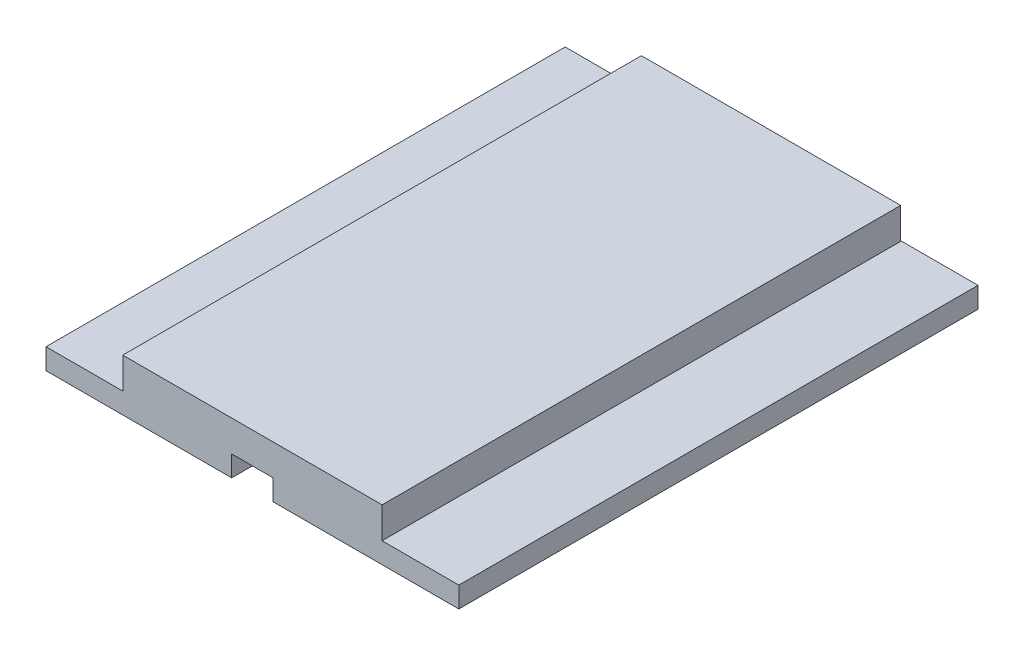
ISO-10303-21;
HEADER;
FILE_DESCRIPTION(('STEP AP214'),'2;1');
FILE_NAME('part.step','',(''),(''),'','','');
FILE_SCHEMA(('AUTOMOTIVE_DESIGN { 1 0 10303 214 1 1 1 1 }'));
ENDSEC;
DATA;
#1=APPLICATION_CONTEXT('core data for automotive mechanical design processes');
#2=APPLICATION_PROTOCOL_DEFINITION('international standard','automotive_design',2000,#1);
#3=PRODUCT_CONTEXT('',#1,'mechanical');
#4=PRODUCT('Part','Part','',(#3));
#5=PRODUCT_RELATED_PRODUCT_CATEGORY('part','',(#4));
#6=PRODUCT_DEFINITION_FORMATION('','',#4);
#7=PRODUCT_DEFINITION_CONTEXT('part definition',#1,'design');
#8=PRODUCT_DEFINITION('design','',#6,#7);
#9=PRODUCT_DEFINITION_SHAPE('','',#8);
#10=(LENGTH_UNIT() NAMED_UNIT(*) SI_UNIT(.MILLI.,.METRE.));
#11=(NAMED_UNIT(*) PLANE_ANGLE_UNIT() SI_UNIT($,.RADIAN.));
#12=(NAMED_UNIT(*) SI_UNIT($,.STERADIAN.) SOLID_ANGLE_UNIT());
#13=UNCERTAINTY_MEASURE_WITH_UNIT(LENGTH_MEASURE(1.E-05),#10,'distance_accuracy_value','');
#14=(GEOMETRIC_REPRESENTATION_CONTEXT(3) GLOBAL_UNCERTAINTY_ASSIGNED_CONTEXT((#13)) GLOBAL_UNIT_ASSIGNED_CONTEXT((#10,
#11,#12)) REPRESENTATION_CONTEXT('',''));
#15=CARTESIAN_POINT('',(0.,0.,0.));
#16=DIRECTION('',(0.,0.,1.));
#17=DIRECTION('',(1.,0.,0.));
#18=AXIS2_PLACEMENT_3D('',#15,#16,#17);
#19=CARTESIAN_POINT('',(-1.94300518134715,0.6,1.15284974093264));
#20=DIRECTION('',(0.,0.,-1.));
#21=DIRECTION('',(-1.,0.,0.));
#22=AXIS2_PLACEMENT_3D('',#19,#20,#21);
#23=PLANE('',#22);
#24=DIRECTION('',(0.,1.,0.));
#25=VECTOR('',#24,1.);
#26=CARTESIAN_POINT('',(-3.42300518134715,0.,1.15284974093264));
#27=LINE('',#26,#25);
#28=CARTESIAN_POINT('',(-3.42300518134715,-0.4,1.15284974093264));
#29=VERTEX_POINT('',#28);
#30=CARTESIAN_POINT('',(-3.42300518134715,0.,1.15284974093264));
#31=VERTEX_POINT('',#30);
#32=EDGE_CURVE('E140',#29,#31,#27,.T.);
#33=ORIENTED_EDGE('',*,*,#32,.F.);
#34=DIRECTION('',(-1.,0.,0.));
#35=VECTOR('',#34,1.);
#36=CARTESIAN_POINT('',(0.156994818652852,-0.4,1.15284974093264));
#37=LINE('',#36,#35);
#38=CARTESIAN_POINT('',(0.156994818652852,-0.4,1.15284974093264));
#39=VERTEX_POINT('',#38);
#40=EDGE_CURVE('E150',#39,#29,#37,.T.);
#41=ORIENTED_EDGE('',*,*,#40,.F.);
#42=DIRECTION('',(0.,1.,0.));
#43=VECTOR('',#42,1.);
#44=CARTESIAN_POINT('',(0.156994818652852,-0.4,1.15284974093264));
#45=LINE('',#44,#43);
#46=CARTESIAN_POINT('',(0.156994818652852,0.,1.15284974093264));
#47=VERTEX_POINT('',#46);
#48=EDGE_CURVE('E330',#39,#47,#45,.T.);
#49=ORIENTED_EDGE('',*,*,#48,.T.);
#50=DIRECTION('',(1.,0.,0.));
#51=VECTOR('',#50,1.);
#52=CARTESIAN_POINT('',(-1.94300518134715,0.,1.15284974093264));
#53=LINE('',#52,#51);
#54=CARTESIAN_POINT('',(0.956994818652852,0.,1.15284974093264));
#55=VERTEX_POINT('',#54);
#56=EDGE_CURVE('E221',#47,#55,#53,.T.);
#57=ORIENTED_EDGE('',*,*,#56,.T.);
#58=DIRECTION('',(0.,1.,0.));
#59=VECTOR('',#58,1.);
#60=CARTESIAN_POINT('',(0.956994818652852,-0.4,1.15284974093264));
#61=LINE('',#60,#59);
#62=CARTESIAN_POINT('',(0.956994818652852,-0.4,1.15284974093264));
#63=VERTEX_POINT('',#62);
#64=EDGE_CURVE('E183',#63,#55,#61,.T.);
#65=ORIENTED_EDGE('',*,*,#64,.F.);
#66=DIRECTION('',(-1.,0.,0.));
#67=VECTOR('',#66,1.);
#68=CARTESIAN_POINT('',(0.956994818652852,-0.4,1.15284974093264));
#69=LINE('',#68,#67);
#70=CARTESIAN_POINT('',(4.53699481865285,-0.4,1.15284974093264));
#71=VERTEX_POINT('',#70);
#72=EDGE_CURVE('E180',#71,#63,#69,.T.);
#73=ORIENTED_EDGE('',*,*,#72,.F.);
#74=DIRECTION('',(0.,-1.,0.));
#75=VECTOR('',#74,1.);
#76=CARTESIAN_POINT('',(4.53699481865285,0.,1.15284974093264));
#77=LINE('',#76,#75);
#78=CARTESIAN_POINT('',(4.53699481865285,0.,1.15284974093264));
#79=VERTEX_POINT('',#78);
#80=EDGE_CURVE('E345',#79,#71,#77,.T.);
#81=ORIENTED_EDGE('',*,*,#80,.F.);
#82=DIRECTION('',(-1.,0.,0.));
#83=VECTOR('',#82,1.);
#84=CARTESIAN_POINT('',(0.956994818652852,0.,1.15284974093264));
#85=LINE('',#84,#83);
#86=CARTESIAN_POINT('',(3.05699481865285,0.,1.15284974093264));
#87=VERTEX_POINT('',#86);
#88=EDGE_CURVE('E176',#79,#87,#85,.T.);
#89=ORIENTED_EDGE('',*,*,#88,.T.);
#90=DIRECTION('',(0.,-1.,0.));
#91=VECTOR('',#90,1.);
#92=CARTESIAN_POINT('',(3.05699481865285,0.6,1.15284974093264));
#93=LINE('',#92,#91);
#94=CARTESIAN_POINT('',(3.05699481865285,0.6,1.15284974093264));
#95=VERTEX_POINT('',#94);
#96=EDGE_CURVE('E53',#95,#87,#93,.T.);
#97=ORIENTED_EDGE('',*,*,#96,.F.);
#98=DIRECTION('',(1.,0.,0.));
#99=VECTOR('',#98,1.);
#100=CARTESIAN_POINT('',(-1.94300518134715,0.6,1.15284974093264));
#101=LINE('',#100,#99);
#102=CARTESIAN_POINT('',(-1.94300518134715,0.6,1.15284974093264));
#103=VERTEX_POINT('',#102);
#104=EDGE_CURVE('E207',#103,#95,#101,.T.);
#105=ORIENTED_EDGE('',*,*,#104,.F.);
#106=DIRECTION('',(0.,-1.,0.));
#107=VECTOR('',#106,1.);
#108=CARTESIAN_POINT('',(-1.94300518134715,0.6,1.15284974093264));
#109=LINE('',#108,#107);
#110=CARTESIAN_POINT('',(-1.94300518134715,0.,1.15284974093264));
#111=VERTEX_POINT('',#110);
#112=EDGE_CURVE('E11',#103,#111,#109,.T.);
#113=ORIENTED_EDGE('',*,*,#112,.T.);
#114=DIRECTION('',(-1.,0.,0.));
#115=VECTOR('',#114,1.);
#116=CARTESIAN_POINT('',(0.156994818652852,0.,1.15284974093264));
#117=LINE('',#116,#115);
#118=EDGE_CURVE('E152',#111,#31,#117,.T.);
#119=ORIENTED_EDGE('',*,*,#118,.T.);
#120=EDGE_LOOP('',(#33,#41,#49,#57,#65,#73,#81,#89,#97,#105,#113,#119));
#121=FACE_BOUND('',#120,.T.);
#122=ADVANCED_FACE('F44',(#121),#23,.F.);
#123=CARTESIAN_POINT('',(0.,0.,0.));
#124=DIRECTION('',(0.,1.,0.));
#125=DIRECTION('',(0.,0.,1.));
#126=AXIS2_PLACEMENT_3D('',#123,#124,#125);
#127=PLANE('',#126);
#128=DIRECTION('',(1.,0.,0.));
#129=VECTOR('',#128,1.);
#130=CARTESIAN_POINT('',(0.156994818652853,0.,-8.85764882904046));
#131=LINE('',#130,#129);
#132=CARTESIAN_POINT('',(-3.42300518134715,0.,-8.85764882904046));
#133=VERTEX_POINT('',#132);
#134=CARTESIAN_POINT('',(0.156994818652853,0.,-8.85764882904046));
#135=VERTEX_POINT('',#134);
#136=EDGE_CURVE('E165',#133,#135,#131,.T.);
#137=ORIENTED_EDGE('',*,*,#136,.F.);
#138=DIRECTION('',(0.,0.,-1.));
#139=VECTOR('',#138,1.);
#140=CARTESIAN_POINT('',(-3.42300518134715,0.,-8.85764882904046));
#141=LINE('',#140,#139);
#142=EDGE_CURVE('E154',#31,#133,#141,.T.);
#143=ORIENTED_EDGE('',*,*,#142,.F.);
#144=ORIENTED_EDGE('',*,*,#118,.F.);
#145=DIRECTION('',(0.,0.,1.));
#146=VECTOR('',#145,1.);
#147=CARTESIAN_POINT('',(-1.94300518134715,0.,-8.84715025906736));
#148=LINE('',#147,#146);
#149=CARTESIAN_POINT('',(-1.94300518134715,0.,-8.84715025906736));
#150=VERTEX_POINT('',#149);
#151=EDGE_CURVE('E202',#150,#111,#148,.T.);
#152=ORIENTED_EDGE('',*,*,#151,.F.);
#153=DIRECTION('',(-1.,0.,0.));
#154=VECTOR('',#153,1.);
#155=CARTESIAN_POINT('',(-1.94300518134715,0.,-8.84715025906736));
#156=LINE('',#155,#154);
#157=CARTESIAN_POINT('',(0.156994818652853,0.,-8.84715025906735));
#158=VERTEX_POINT('',#157);
#159=EDGE_CURVE('E227',#158,#150,#156,.T.);
#160=ORIENTED_EDGE('',*,*,#159,.F.);
#161=DIRECTION('',(0.,0.,1.));
#162=VECTOR('',#161,1.);
#163=CARTESIAN_POINT('',(0.156994818652852,0.,1.15284974093264));
#164=LINE('',#163,#162);
#165=EDGE_CURVE('E327',#135,#158,#164,.T.);
#166=ORIENTED_EDGE('',*,*,#165,.F.);
#167=EDGE_LOOP('',(#137,#143,#144,#152,#160,#166));
#168=FACE_BOUND('',#167,.T.);
#169=ADVANCED_FACE('F288',(#168),#127,.T.);
#170=CARTESIAN_POINT('',(0.156994818652853,-0.4,-8.85764882904046));
#171=DIRECTION('',(0.,0.,1.));
#172=DIRECTION('',(1.,0.,0.));
#173=AXIS2_PLACEMENT_3D('',#170,#171,#172);
#174=PLANE('',#173);
#175=DIRECTION('',(0.,-1.,0.));
#176=VECTOR('',#175,1.);
#177=CARTESIAN_POINT('',(-3.42300518134715,0.,-8.85764882904046));
#178=LINE('',#177,#176);
#179=CARTESIAN_POINT('',(-3.42300518134715,-0.4,-8.85764882904046));
#180=VERTEX_POINT('',#179);
#181=EDGE_CURVE('E60',#133,#180,#178,.T.);
#182=ORIENTED_EDGE('',*,*,#181,.F.);
#183=ORIENTED_EDGE('',*,*,#136,.T.);
#184=DIRECTION('',(0.,1.,0.));
#185=VECTOR('',#184,1.);
#186=CARTESIAN_POINT('',(0.156994818652853,-0.4,-8.85764882904046));
#187=LINE('',#186,#185);
#188=CARTESIAN_POINT('',(0.156994818652853,-0.4,-8.85764882904046));
#189=VERTEX_POINT('',#188);
#190=EDGE_CURVE('E167',#189,#135,#187,.T.);
#191=ORIENTED_EDGE('',*,*,#190,.F.);
#192=DIRECTION('',(1.,0.,0.));
#193=VECTOR('',#192,1.);
#194=CARTESIAN_POINT('',(0.156994818652853,-0.4,-8.85764882904046));
#195=LINE('',#194,#193);
#196=EDGE_CURVE('E161',#180,#189,#195,.T.);
#197=ORIENTED_EDGE('',*,*,#196,.F.);
#198=EDGE_LOOP('',(#182,#183,#191,#197));
#199=FACE_BOUND('',#198,.T.);
#200=ADVANCED_FACE('F293',(#199),#174,.F.);
#201=CARTESIAN_POINT('',(0.,-0.4,0.));
#202=DIRECTION('',(0.,1.,0.));
#203=DIRECTION('',(0.,0.,1.));
#204=AXIS2_PLACEMENT_3D('',#201,#202,#203);
#205=PLANE('',#204);
#206=DIRECTION('',(0.,0.,1.));
#207=VECTOR('',#206,1.);
#208=CARTESIAN_POINT('',(-3.42300518134715,-0.4,-8.85764882904046));
#209=LINE('',#208,#207);
#210=EDGE_CURVE('E137',#180,#29,#209,.T.);
#211=ORIENTED_EDGE('',*,*,#210,.F.);
#212=ORIENTED_EDGE('',*,*,#196,.T.);
#213=DIRECTION('',(0.,0.,1.));
#214=VECTOR('',#213,1.);
#215=CARTESIAN_POINT('',(0.156994818652852,-0.4,1.15284974093264));
#216=LINE('',#215,#214);
#217=EDGE_CURVE('E158',#189,#39,#216,.T.);
#218=ORIENTED_EDGE('',*,*,#217,.T.);
#219=ORIENTED_EDGE('',*,*,#40,.T.);
#220=EDGE_LOOP('',(#211,#212,#218,#219));
#221=FACE_BOUND('',#220,.T.);
#222=ADVANCED_FACE('F156',(#221),#205,.F.);
#223=CARTESIAN_POINT('',(0.956994818652853,-0.4,-8.85764882904046));
#224=DIRECTION('',(0.,0.,1.));
#225=DIRECTION('',(1.,0.,0.));
#226=AXIS2_PLACEMENT_3D('',#223,#224,#225);
#227=PLANE('',#226);
#228=DIRECTION('',(0.,1.,0.));
#229=VECTOR('',#228,1.);
#230=CARTESIAN_POINT('',(4.53699481865285,0.,-8.85764882904046));
#231=LINE('',#230,#229);
#232=CARTESIAN_POINT('',(4.53699481865285,-0.4,-8.85764882904046));
#233=VERTEX_POINT('',#232);
#234=CARTESIAN_POINT('',(4.53699481865285,0.,-8.85764882904046));
#235=VERTEX_POINT('',#234);
#236=EDGE_CURVE('E68',#233,#235,#231,.T.);
#237=ORIENTED_EDGE('',*,*,#236,.F.);
#238=DIRECTION('',(1.,0.,0.));
#239=VECTOR('',#238,1.);
#240=CARTESIAN_POINT('',(0.956994818652853,-0.4,-8.85764882904046));
#241=LINE('',#240,#239);
#242=CARTESIAN_POINT('',(0.956994818652853,-0.4,-8.85764882904046));
#243=VERTEX_POINT('',#242);
#244=EDGE_CURVE('E175',#243,#233,#241,.T.);
#245=ORIENTED_EDGE('',*,*,#244,.F.);
#246=DIRECTION('',(0.,1.,0.));
#247=VECTOR('',#246,1.);
#248=CARTESIAN_POINT('',(0.956994818652853,-0.4,-8.85764882904046));
#249=LINE('',#248,#247);
#250=CARTESIAN_POINT('',(0.956994818652853,0.,-8.85764882904046));
#251=VERTEX_POINT('',#250);
#252=EDGE_CURVE('E198',#243,#251,#249,.T.);
#253=ORIENTED_EDGE('',*,*,#252,.T.);
#254=DIRECTION('',(1.,0.,0.));
#255=VECTOR('',#254,1.);
#256=CARTESIAN_POINT('',(0.956994818652853,0.,-8.85764882904046));
#257=LINE('',#256,#255);
#258=EDGE_CURVE('E188',#251,#235,#257,.T.);
#259=ORIENTED_EDGE('',*,*,#258,.T.);
#260=EDGE_LOOP('',(#237,#245,#253,#259));
#261=FACE_BOUND('',#260,.T.);
#262=ADVANCED_FACE('F306',(#261),#227,.F.);
#263=CARTESIAN_POINT('',(0.,-0.4,0.));
#264=DIRECTION('',(0.,-1.,0.));
#265=DIRECTION('',(0.,0.,-1.));
#266=AXIS2_PLACEMENT_3D('',#263,#264,#265);
#267=PLANE('',#266);
#268=ORIENTED_EDGE('',*,*,#244,.T.);
#269=DIRECTION('',(0.,0.,-1.));
#270=VECTOR('',#269,1.);
#271=CARTESIAN_POINT('',(4.53699481865285,-0.4,1.15284974093264));
#272=LINE('',#271,#270);
#273=EDGE_CURVE('E319',#71,#233,#272,.T.);
#274=ORIENTED_EDGE('',*,*,#273,.F.);
#275=ORIENTED_EDGE('',*,*,#72,.T.);
#276=DIRECTION('',(0.,0.,-1.));
#277=VECTOR('',#276,1.);
#278=CARTESIAN_POINT('',(0.956994818652852,-0.4,1.15284974093264));
#279=LINE('',#278,#277);
#280=EDGE_CURVE('E171',#63,#243,#279,.T.);
#281=ORIENTED_EDGE('',*,*,#280,.T.);
#282=EDGE_LOOP('',(#268,#274,#275,#281));
#283=FACE_BOUND('',#282,.T.);
#284=ADVANCED_FACE('F301',(#283),#267,.T.);
#285=CARTESIAN_POINT('',(0.,0.,0.));
#286=DIRECTION('',(0.,-1.,0.));
#287=DIRECTION('',(0.,0.,-1.));
#288=AXIS2_PLACEMENT_3D('',#285,#286,#287);
#289=PLANE('',#288);
#290=DIRECTION('',(0.,0.,1.));
#291=VECTOR('',#290,1.);
#292=CARTESIAN_POINT('',(4.53699481865285,0.,1.15284974093264));
#293=LINE('',#292,#291);
#294=EDGE_CURVE('E318',#235,#79,#293,.T.);
#295=ORIENTED_EDGE('',*,*,#294,.F.);
#296=ORIENTED_EDGE('',*,*,#258,.F.);
#297=DIRECTION('',(0.,0.,-1.));
#298=VECTOR('',#297,1.);
#299=CARTESIAN_POINT('',(0.956994818652852,0.,1.15284974093264));
#300=LINE('',#299,#298);
#301=CARTESIAN_POINT('',(0.956994818652853,0.,-8.84715025906735));
#302=VERTEX_POINT('',#301);
#303=EDGE_CURVE('E189',#302,#251,#300,.T.);
#304=ORIENTED_EDGE('',*,*,#303,.F.);
#305=CARTESIAN_POINT('',(3.05699481865285,0.,-8.84715025906736));
#306=VERTEX_POINT('',#305);
#307=EDGE_CURVE('E208',#306,#302,#156,.T.);
#308=ORIENTED_EDGE('',*,*,#307,.F.);
#309=DIRECTION('',(0.,0.,-1.));
#310=VECTOR('',#309,1.);
#311=CARTESIAN_POINT('',(3.05699481865285,0.,-8.84715025906736));
#312=LINE('',#311,#310);
#313=EDGE_CURVE('E224',#87,#306,#312,.T.);
#314=ORIENTED_EDGE('',*,*,#313,.F.);
#315=ORIENTED_EDGE('',*,*,#88,.F.);
#316=EDGE_LOOP('',(#295,#296,#304,#308,#314,#315));
#317=FACE_BOUND('',#316,.T.);
#318=ADVANCED_FACE('F248',(#317),#289,.F.);
#319=CARTESIAN_POINT('',(0.,0.,0.));
#320=DIRECTION('',(0.,1.,0.));
#321=DIRECTION('',(0.,0.,1.));
#322=AXIS2_PLACEMENT_3D('',#319,#320,#321);
#323=PLANE('',#322);
#324=EDGE_CURVE('E262',#158,#47,#164,.T.);
#325=ORIENTED_EDGE('',*,*,#324,.F.);
#326=EDGE_CURVE('E230',#302,#158,#156,.T.);
#327=ORIENTED_EDGE('',*,*,#326,.F.);
#328=EDGE_CURVE('E184',#55,#302,#300,.T.);
#329=ORIENTED_EDGE('',*,*,#328,.F.);
#330=ORIENTED_EDGE('',*,*,#56,.F.);
#331=EDGE_LOOP('',(#325,#327,#329,#330));
#332=FACE_BOUND('',#331,.T.);
#333=ADVANCED_FACE('F260',(#332),#323,.F.);
#334=CARTESIAN_POINT('',(-1.94300518134715,0.6,-8.84715025906736));
#335=DIRECTION('',(1.,0.,0.));
#336=DIRECTION('',(0.,0.,-1.));
#337=AXIS2_PLACEMENT_3D('',#334,#335,#336);
#338=PLANE('',#337);
#339=ORIENTED_EDGE('',*,*,#151,.T.);
#340=ORIENTED_EDGE('',*,*,#112,.F.);
#341=DIRECTION('',(0.,0.,1.));
#342=VECTOR('',#341,1.);
#343=CARTESIAN_POINT('',(-1.94300518134715,0.6,-8.84715025906736));
#344=LINE('',#343,#342);
#345=CARTESIAN_POINT('',(-1.94300518134715,0.6,-8.84715025906736));
#346=VERTEX_POINT('',#345);
#347=EDGE_CURVE('E203',#346,#103,#344,.T.);
#348=ORIENTED_EDGE('',*,*,#347,.F.);
#349=DIRECTION('',(0.,-1.,0.));
#350=VECTOR('',#349,1.);
#351=CARTESIAN_POINT('',(-1.94300518134715,0.6,-8.84715025906736));
#352=LINE('',#351,#350);
#353=EDGE_CURVE('E217',#346,#150,#352,.T.);
#354=ORIENTED_EDGE('',*,*,#353,.T.);
#355=EDGE_LOOP('',(#339,#340,#348,#354));
#356=FACE_BOUND('',#355,.T.);
#357=ADVANCED_FACE('F46',(#356),#338,.F.);
#358=CARTESIAN_POINT('',(3.05699481865285,0.6,-8.84715025906736));
#359=DIRECTION('',(-1.,0.,0.));
#360=DIRECTION('',(0.,0.,1.));
#361=AXIS2_PLACEMENT_3D('',#358,#359,#360);
#362=PLANE('',#361);
#363=ORIENTED_EDGE('',*,*,#313,.T.);
#364=DIRECTION('',(0.,-1.,0.));
#365=VECTOR('',#364,1.);
#366=CARTESIAN_POINT('',(3.05699481865285,0.6,-8.84715025906736));
#367=LINE('',#366,#365);
#368=CARTESIAN_POINT('',(3.05699481865285,0.6,-8.84715025906736));
#369=VERTEX_POINT('',#368);
#370=EDGE_CURVE('E234',#369,#306,#367,.T.);
#371=ORIENTED_EDGE('',*,*,#370,.F.);
#372=DIRECTION('',(0.,0.,-1.));
#373=VECTOR('',#372,1.);
#374=CARTESIAN_POINT('',(3.05699481865285,0.6,-8.84715025906736));
#375=LINE('',#374,#373);
#376=EDGE_CURVE('E211',#95,#369,#375,.T.);
#377=ORIENTED_EDGE('',*,*,#376,.F.);
#378=ORIENTED_EDGE('',*,*,#96,.T.);
#379=EDGE_LOOP('',(#363,#371,#377,#378));
#380=FACE_BOUND('',#379,.T.);
#381=ADVANCED_FACE('F243',(#380),#362,.F.);
#382=CARTESIAN_POINT('',(-1.94300518134715,0.6,-8.84715025906736));
#383=DIRECTION('',(0.,0.,1.));
#384=DIRECTION('',(1.,0.,0.));
#385=AXIS2_PLACEMENT_3D('',#382,#383,#384);
#386=PLANE('',#385);
#387=ORIENTED_EDGE('',*,*,#307,.T.);
#388=ORIENTED_EDGE('',*,*,#326,.T.);
#389=ORIENTED_EDGE('',*,*,#159,.T.);
#390=ORIENTED_EDGE('',*,*,#353,.F.);
#391=DIRECTION('',(-1.,0.,0.));
#392=VECTOR('',#391,1.);
#393=CARTESIAN_POINT('',(-1.94300518134715,0.6,-8.84715025906736));
#394=LINE('',#393,#392);
#395=EDGE_CURVE('E214',#369,#346,#394,.T.);
#396=ORIENTED_EDGE('',*,*,#395,.F.);
#397=ORIENTED_EDGE('',*,*,#370,.T.);
#398=EDGE_LOOP('',(#387,#388,#389,#390,#396,#397));
#399=FACE_BOUND('',#398,.T.);
#400=ADVANCED_FACE('F254',(#399),#386,.F.);
#401=CARTESIAN_POINT('',(0.,0.6,0.));
#402=DIRECTION('',(0.,1.,0.));
#403=DIRECTION('',(0.,0.,1.));
#404=AXIS2_PLACEMENT_3D('',#401,#402,#403);
#405=PLANE('',#404);
#406=ORIENTED_EDGE('',*,*,#347,.T.);
#407=ORIENTED_EDGE('',*,*,#104,.T.);
#408=ORIENTED_EDGE('',*,*,#376,.T.);
#409=ORIENTED_EDGE('',*,*,#395,.T.);
#410=EDGE_LOOP('',(#406,#407,#408,#409));
#411=FACE_BOUND('',#410,.T.);
#412=ADVANCED_FACE('F273',(#411),#405,.T.);
#413=CARTESIAN_POINT('',(0.956994818652852,-0.4,1.15284974093264));
#414=DIRECTION('',(1.,0.,0.));
#415=DIRECTION('',(0.,0.,-1.));
#416=AXIS2_PLACEMENT_3D('',#413,#414,#415);
#417=PLANE('',#416);
#418=ORIENTED_EDGE('',*,*,#328,.T.);
#419=ORIENTED_EDGE('',*,*,#303,.T.);
#420=ORIENTED_EDGE('',*,*,#252,.F.);
#421=ORIENTED_EDGE('',*,*,#280,.F.);
#422=ORIENTED_EDGE('',*,*,#64,.T.);
#423=EDGE_LOOP('',(#418,#419,#420,#421,#422));
#424=FACE_BOUND('',#423,.T.);
#425=ADVANCED_FACE('F275',(#424),#417,.F.);
#426=CARTESIAN_POINT('',(0.156994818652852,-0.4,1.15284974093264));
#427=DIRECTION('',(-1.,0.,0.));
#428=DIRECTION('',(0.,0.,1.));
#429=AXIS2_PLACEMENT_3D('',#426,#427,#428);
#430=PLANE('',#429);
#431=ORIENTED_EDGE('',*,*,#165,.T.);
#432=ORIENTED_EDGE('',*,*,#324,.T.);
#433=ORIENTED_EDGE('',*,*,#48,.F.);
#434=ORIENTED_EDGE('',*,*,#217,.F.);
#435=ORIENTED_EDGE('',*,*,#190,.T.);
#436=EDGE_LOOP('',(#431,#432,#433,#434,#435));
#437=FACE_BOUND('',#436,.T.);
#438=ADVANCED_FACE('F281',(#437),#430,.F.);
#439=CARTESIAN_POINT('',(4.53699481865285,0.,0.));
#440=DIRECTION('',(1.,0.,0.));
#441=DIRECTION('',(0.,0.,-1.));
#442=AXIS2_PLACEMENT_3D('',#439,#440,#441);
#443=PLANE('',#442);
#444=ORIENTED_EDGE('',*,*,#80,.T.);
#445=ORIENTED_EDGE('',*,*,#273,.T.);
#446=ORIENTED_EDGE('',*,*,#236,.T.);
#447=ORIENTED_EDGE('',*,*,#294,.T.);
#448=EDGE_LOOP('',(#444,#445,#446,#447));
#449=FACE_BOUND('',#448,.T.);
#450=ADVANCED_FACE('F362',(#449),#443,.T.);
#451=CARTESIAN_POINT('',(-3.42300518134715,0.,0.));
#452=DIRECTION('',(-1.,0.,0.));
#453=DIRECTION('',(0.,0.,1.));
#454=AXIS2_PLACEMENT_3D('',#451,#452,#453);
#455=PLANE('',#454);
#456=ORIENTED_EDGE('',*,*,#181,.T.);
#457=ORIENTED_EDGE('',*,*,#210,.T.);
#458=ORIENTED_EDGE('',*,*,#32,.T.);
#459=ORIENTED_EDGE('',*,*,#142,.T.);
#460=EDGE_LOOP('',(#456,#457,#458,#459));
#461=FACE_BOUND('',#460,.T.);
#462=ADVANCED_FACE('F139',(#461),#455,.T.);
#463=CLOSED_SHELL('',(#122,#169,#200,#222,#262,#284,#318,#333,#357,#381,#400,#412,#425,#438,
#450,#462));
#464=MANIFOLD_SOLID_BREP('B2',#463);
#465=ADVANCED_BREP_SHAPE_REPRESENTATION('',(#18,#464),#14);
#466=SHAPE_DEFINITION_REPRESENTATION(#9,#465);
ENDSEC;
END-ISO-10303-21;
